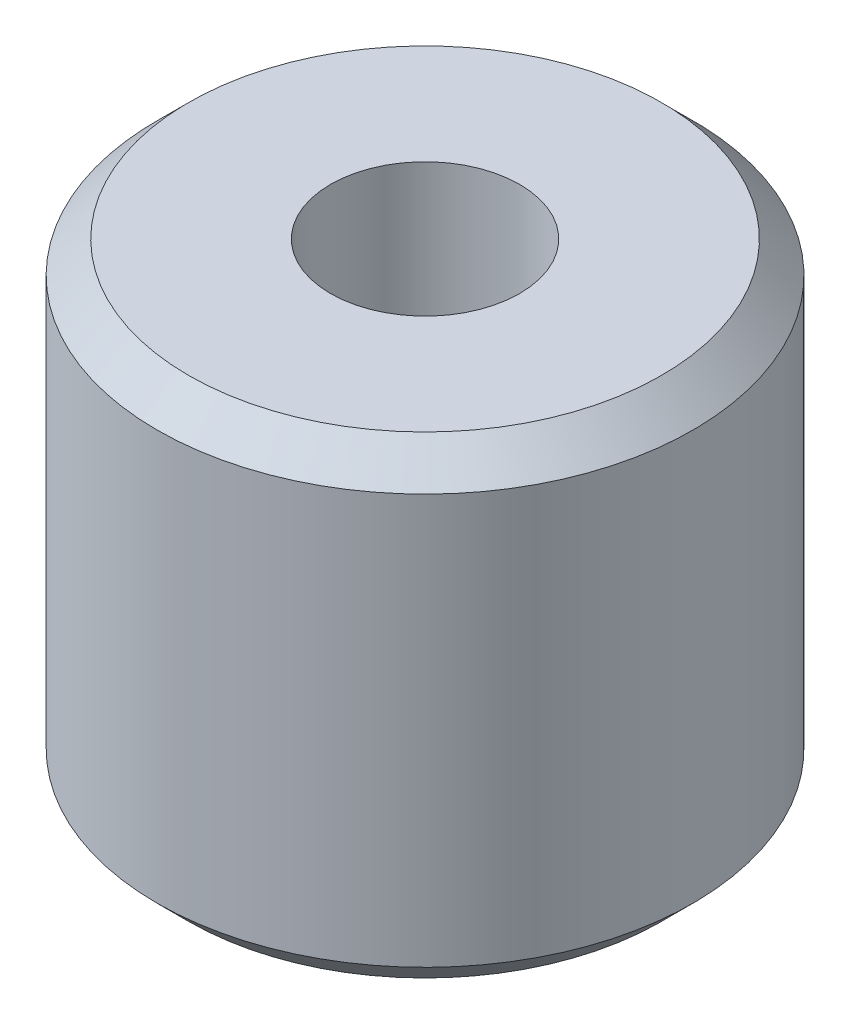
ISO-10303-21;
HEADER;
FILE_DESCRIPTION(('STEP AP214'),'2;1');
FILE_NAME('part.step','',(''),(''),'','','');
FILE_SCHEMA(('AUTOMOTIVE_DESIGN { 1 0 10303 214 1 1 1 1 }'));
ENDSEC;
DATA;
#1=APPLICATION_CONTEXT('core data for automotive mechanical design processes');
#2=APPLICATION_PROTOCOL_DEFINITION('international standard','automotive_design',2000,#1);
#3=PRODUCT_CONTEXT('',#1,'mechanical');
#4=PRODUCT('Part','Part','',(#3));
#5=PRODUCT_RELATED_PRODUCT_CATEGORY('part','',(#4));
#6=PRODUCT_DEFINITION_FORMATION('','',#4);
#7=PRODUCT_DEFINITION_CONTEXT('part definition',#1,'design');
#8=PRODUCT_DEFINITION('design','',#6,#7);
#9=PRODUCT_DEFINITION_SHAPE('','',#8);
#10=(LENGTH_UNIT() NAMED_UNIT(*) SI_UNIT(.MILLI.,.METRE.));
#11=(NAMED_UNIT(*) PLANE_ANGLE_UNIT() SI_UNIT($,.RADIAN.));
#12=(NAMED_UNIT(*) SI_UNIT($,.STERADIAN.) SOLID_ANGLE_UNIT());
#13=UNCERTAINTY_MEASURE_WITH_UNIT(LENGTH_MEASURE(1.E-05),#10,'distance_accuracy_value','');
#14=(GEOMETRIC_REPRESENTATION_CONTEXT(3) GLOBAL_UNCERTAINTY_ASSIGNED_CONTEXT((#13)) GLOBAL_UNIT_ASSIGNED_CONTEXT((#10,
#11,#12)) REPRESENTATION_CONTEXT('',''));
#15=CARTESIAN_POINT('',(0.,0.,0.));
#16=DIRECTION('',(0.,0.,1.));
#17=DIRECTION('',(1.,0.,0.));
#18=AXIS2_PLACEMENT_3D('',#15,#16,#17);
#19=CARTESIAN_POINT('',(0.,15.,0.));
#20=DIRECTION('',(0.,1.,0.));
#21=DIRECTION('',(0.,0.,1.));
#22=AXIS2_PLACEMENT_3D('',#19,#20,#21);
#23=PLANE('',#22);
#24=CARTESIAN_POINT('',(0.,15.,0.));
#25=DIRECTION('',(0.,1.,0.));
#26=DIRECTION('',(0.,0.,1.));
#27=AXIS2_PLACEMENT_3D('',#24,#25,#26);
#28=CIRCLE('',#27,7.5);
#29=CARTESIAN_POINT('',(0.,15.,7.5));
#30=VERTEX_POINT('',#29);
#31=EDGE_CURVE('E10',#30,#30,#28,.T.);
#32=ORIENTED_EDGE('',*,*,#31,.T.);
#33=EDGE_LOOP('',(#32));
#34=FACE_BOUND('',#33,.T.);
#35=CARTESIAN_POINT('',(0.,15.,0.));
#36=DIRECTION('',(0.,1.,0.));
#37=DIRECTION('',(0.,0.,1.));
#38=AXIS2_PLACEMENT_3D('',#35,#36,#37);
#39=CIRCLE('',#38,3.);
#40=CARTESIAN_POINT('',(0.,15.,3.));
#41=VERTEX_POINT('',#40);
#42=EDGE_CURVE('E63',#41,#41,#39,.T.);
#43=ORIENTED_EDGE('',*,*,#42,.F.);
#44=EDGE_LOOP('',(#43));
#45=FACE_BOUND('',#44,.T.);
#46=ADVANCED_FACE('F38',(#34,#45),#23,.T.);
#47=CARTESIAN_POINT('',(0.,0.,0.));
#48=DIRECTION('',(0.,1.,0.));
#49=DIRECTION('',(0.,0.,1.));
#50=AXIS2_PLACEMENT_3D('',#47,#48,#49);
#51=PLANE('',#50);
#52=CARTESIAN_POINT('',(0.,0.,0.));
#53=DIRECTION('',(0.,1.,0.));
#54=DIRECTION('',(0.,0.,1.));
#55=AXIS2_PLACEMENT_3D('',#52,#53,#54);
#56=CIRCLE('',#55,7.50000000000001);
#57=CARTESIAN_POINT('',(0.,0.,7.50000000000001));
#58=VERTEX_POINT('',#57);
#59=EDGE_CURVE('E47',#58,#58,#56,.F.);
#60=ORIENTED_EDGE('',*,*,#59,.T.);
#61=EDGE_LOOP('',(#60));
#62=FACE_BOUND('',#61,.T.);
#63=CARTESIAN_POINT('',(0.,0.,0.));
#64=DIRECTION('',(0.,1.,0.));
#65=DIRECTION('',(0.,0.,1.));
#66=AXIS2_PLACEMENT_3D('',#63,#64,#65);
#67=CIRCLE('',#66,3.);
#68=CARTESIAN_POINT('',(0.,0.,3.));
#69=VERTEX_POINT('',#68);
#70=EDGE_CURVE('E64',#69,#69,#67,.T.);
#71=ORIENTED_EDGE('',*,*,#70,.T.);
#72=EDGE_LOOP('',(#71));
#73=FACE_BOUND('',#72,.T.);
#74=ADVANCED_FACE('F76',(#62,#73),#51,.F.);
#75=CARTESIAN_POINT('',(0.,15.,0.));
#76=DIRECTION('',(0.,-1.,0.));
#77=DIRECTION('',(0.,0.,-1.));
#78=AXIS2_PLACEMENT_3D('',#75,#76,#77);
#79=CYLINDRICAL_SURFACE('',#78,8.5);
#80=CARTESIAN_POINT('',(0.,0.999999999999994,0.));
#81=DIRECTION('',(0.,1.,0.));
#82=DIRECTION('',(0.,0.,1.));
#83=AXIS2_PLACEMENT_3D('',#80,#81,#82);
#84=CIRCLE('',#83,8.5);
#85=CARTESIAN_POINT('',(0.,0.999999999999994,8.5));
#86=VERTEX_POINT('',#85);
#87=EDGE_CURVE('E52',#86,#86,#84,.T.);
#88=ORIENTED_EDGE('',*,*,#87,.T.);
#89=EDGE_LOOP('',(#88));
#90=FACE_BOUND('',#89,.T.);
#91=CARTESIAN_POINT('',(0.,14.,0.));
#92=DIRECTION('',(0.,1.,0.));
#93=DIRECTION('',(0.,0.,1.));
#94=AXIS2_PLACEMENT_3D('',#91,#92,#93);
#95=CIRCLE('',#94,8.5);
#96=CARTESIAN_POINT('',(0.,14.,8.5));
#97=VERTEX_POINT('',#96);
#98=EDGE_CURVE('E57',#97,#97,#95,.F.);
#99=ORIENTED_EDGE('',*,*,#98,.T.);
#100=EDGE_LOOP('',(#99));
#101=FACE_BOUND('',#100,.T.);
#102=ADVANCED_FACE('F81',(#90,#101),#79,.T.);
#103=CARTESIAN_POINT('',(0.,15.,0.));
#104=DIRECTION('',(0.,-1.,0.));
#105=DIRECTION('',(0.,0.,-1.));
#106=AXIS2_PLACEMENT_3D('',#103,#104,#105);
#107=CYLINDRICAL_SURFACE('',#106,3.);
#108=ORIENTED_EDGE('',*,*,#42,.T.);
#109=EDGE_LOOP('',(#108));
#110=FACE_BOUND('',#109,.T.);
#111=ORIENTED_EDGE('',*,*,#70,.F.);
#112=EDGE_LOOP('',(#111));
#113=FACE_BOUND('',#112,.T.);
#114=ADVANCED_FACE('F72',(#110,#113),#107,.F.);
#115=CARTESIAN_POINT('',(0.,0.999999999999994,0.));
#116=DIRECTION('',(0.,1.,0.));
#117=DIRECTION('',(0.,0.,1.));
#118=AXIS2_PLACEMENT_3D('',#115,#116,#117);
#119=CONICAL_SURFACE('',#118,8.5,0.78539816339745);
#120=ORIENTED_EDGE('',*,*,#59,.F.);
#121=EDGE_LOOP('',(#120));
#122=FACE_BOUND('',#121,.T.);
#123=ORIENTED_EDGE('',*,*,#87,.F.);
#124=EDGE_LOOP('',(#123));
#125=FACE_BOUND('',#124,.T.);
#126=ADVANCED_FACE('F88',(#122,#125),#119,.T.);
#127=CARTESIAN_POINT('',(0.,15.,0.));
#128=DIRECTION('',(0.,-1.,0.));
#129=DIRECTION('',(0.,0.,-1.));
#130=AXIS2_PLACEMENT_3D('',#127,#128,#129);
#131=CONICAL_SURFACE('',#130,7.5,0.785398163397447);
#132=ORIENTED_EDGE('',*,*,#98,.F.);
#133=EDGE_LOOP('',(#132));
#134=FACE_BOUND('',#133,.T.);
#135=ORIENTED_EDGE('',*,*,#31,.F.);
#136=EDGE_LOOP('',(#135));
#137=FACE_BOUND('',#136,.T.);
#138=ADVANCED_FACE('F41',(#134,#137),#131,.T.);
#139=CLOSED_SHELL('',(#46,#74,#102,#114,#126,#138));
#140=MANIFOLD_SOLID_BREP('B2',#139);
#141=ADVANCED_BREP_SHAPE_REPRESENTATION('',(#18,#140),#14);
#142=SHAPE_DEFINITION_REPRESENTATION(#9,#141);
ENDSEC;
END-ISO-10303-21;
